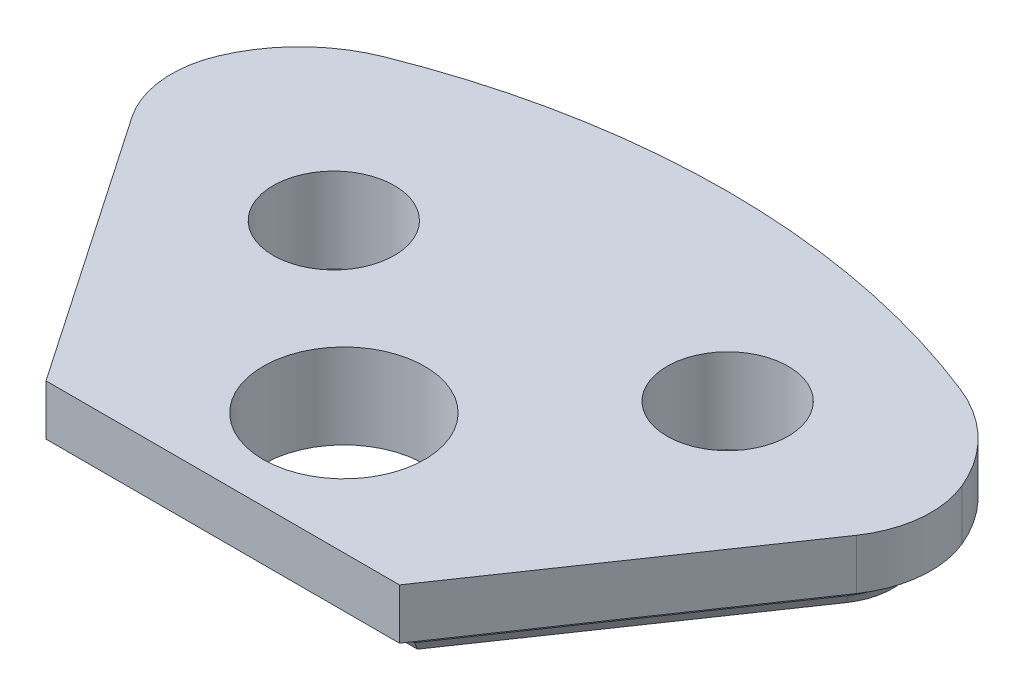
ISO-10303-21;
HEADER;
FILE_DESCRIPTION(('STEP AP214'),'2;1');
FILE_NAME('part.step','',(''),(''),'','','');
FILE_SCHEMA(('AUTOMOTIVE_DESIGN { 1 0 10303 214 1 1 1 1 }'));
ENDSEC;
DATA;
#1=APPLICATION_CONTEXT('core data for automotive mechanical design processes');
#2=APPLICATION_PROTOCOL_DEFINITION('international standard','automotive_design',2000,#1);
#3=PRODUCT_CONTEXT('',#1,'mechanical');
#4=PRODUCT('Part','Part','',(#3));
#5=PRODUCT_RELATED_PRODUCT_CATEGORY('part','',(#4));
#6=PRODUCT_DEFINITION_FORMATION('','',#4);
#7=PRODUCT_DEFINITION_CONTEXT('part definition',#1,'design');
#8=PRODUCT_DEFINITION('design','',#6,#7);
#9=PRODUCT_DEFINITION_SHAPE('','',#8);
#10=(LENGTH_UNIT() NAMED_UNIT(*) SI_UNIT(.MILLI.,.METRE.));
#11=(NAMED_UNIT(*) PLANE_ANGLE_UNIT() SI_UNIT($,.RADIAN.));
#12=(NAMED_UNIT(*) SI_UNIT($,.STERADIAN.) SOLID_ANGLE_UNIT());
#13=UNCERTAINTY_MEASURE_WITH_UNIT(LENGTH_MEASURE(1.E-05),#10,'distance_accuracy_value','');
#14=(GEOMETRIC_REPRESENTATION_CONTEXT(3) GLOBAL_UNCERTAINTY_ASSIGNED_CONTEXT((#13)) GLOBAL_UNIT_ASSIGNED_CONTEXT((#10,
#11,#12)) REPRESENTATION_CONTEXT('',''));
#15=CARTESIAN_POINT('',(0.,0.,0.));
#16=DIRECTION('',(0.,0.,1.));
#17=DIRECTION('',(1.,0.,0.));
#18=AXIS2_PLACEMENT_3D('',#15,#16,#17);
#19=CARTESIAN_POINT('',(0.,0.,27.2));
#20=DIRECTION('',(0.,-1.,0.));
#21=DIRECTION('',(0.,0.,-1.));
#22=AXIS2_PLACEMENT_3D('',#19,#20,#21);
#23=PLANE('',#22);
#24=CARTESIAN_POINT('',(23.,0.,-30.5913488335408));
#25=DIRECTION('',(0.,-1.,0.));
#26=DIRECTION('',(0.,0.,-1.));
#27=AXIS2_PLACEMENT_3D('',#24,#25,#26);
#28=CIRCLE('',#27,15.);
#29=CARTESIAN_POINT('',(28.5466237942122,0.,-44.5281692917902));
#30=VERTEX_POINT('',#29);
#31=CARTESIAN_POINT('',(36.8359769781785,0.,-36.384943663982));
#32=VERTEX_POINT('',#31);
#33=EDGE_CURVE('E232',#30,#32,#28,.T.);
#34=ORIENTED_EDGE('',*,*,#33,.T.);
#35=CARTESIAN_POINT('',(27.6119923260595,0.,-32.5225471103545));
#36=DIRECTION('',(0.,-1.,0.));
#37=DIRECTION('',(0.,0.,-1.));
#38=AXIS2_PLACEMENT_3D('',#35,#36,#37);
#39=CIRCLE('',#38,10.);
#40=CARTESIAN_POINT('',(35.8684387410676,0.,-26.880642060099));
#41=VERTEX_POINT('',#40);
#42=EDGE_CURVE('E245',#32,#41,#39,.T.);
#43=ORIENTED_EDGE('',*,*,#42,.T.);
#44=DIRECTION('',(0.564190505025556,0.,-0.825644641500814));
#45=VECTOR('',#44,1.);
#46=CARTESIAN_POINT('',(17.5,0.,0.));
#47=LINE('',#46,#45);
#48=CARTESIAN_POINT('',(17.5,0.,0.));
#49=VERTEX_POINT('',#48);
#50=EDGE_CURVE('E215',#49,#41,#47,.T.);
#51=ORIENTED_EDGE('',*,*,#50,.F.);
#52=DIRECTION('',(1.,0.,0.));
#53=VECTOR('',#52,1.);
#54=CARTESIAN_POINT('',(17.5,0.,0.));
#55=LINE('',#54,#53);
#56=CARTESIAN_POINT('',(-17.5,0.,0.));
#57=VERTEX_POINT('',#56);
#58=EDGE_CURVE('E192',#57,#49,#55,.T.);
#59=ORIENTED_EDGE('',*,*,#58,.F.);
#60=DIRECTION('',(0.564190505025556,0.,0.825644641500814));
#61=VECTOR('',#60,1.);
#62=CARTESIAN_POINT('',(-38.,0.,-30.));
#63=LINE('',#62,#61);
#64=CARTESIAN_POINT('',(-35.8684387410676,0.,-26.880642060099));
#65=VERTEX_POINT('',#64);
#66=EDGE_CURVE('E189',#65,#57,#63,.T.);
#67=ORIENTED_EDGE('',*,*,#66,.F.);
#68=CARTESIAN_POINT('',(-27.6119923260595,0.,-32.5225471103545));
#69=DIRECTION('',(0.,-1.,0.));
#70=DIRECTION('',(0.,0.,-1.));
#71=AXIS2_PLACEMENT_3D('',#68,#69,#70);
#72=CIRCLE('',#71,10.);
#73=CARTESIAN_POINT('',(-36.8359769781785,0.,-36.384943663982));
#74=VERTEX_POINT('',#73);
#75=EDGE_CURVE('E243',#65,#74,#72,.T.);
#76=ORIENTED_EDGE('',*,*,#75,.T.);
#77=CARTESIAN_POINT('',(-23.,0.,-30.5913488335408));
#78=DIRECTION('',(0.,-1.,0.));
#79=DIRECTION('',(0.,0.,-1.));
#80=AXIS2_PLACEMENT_3D('',#77,#78,#79);
#81=CIRCLE('',#80,15.);
#82=CARTESIAN_POINT('',(-28.5466237942122,0.,-44.5281692917902));
#83=VERTEX_POINT('',#82);
#84=EDGE_CURVE('E230',#74,#83,#81,.T.);
#85=ORIENTED_EDGE('',*,*,#84,.T.);
#86=CARTESIAN_POINT('',(0.,0.,27.2));
#87=DIRECTION('',(0.,1.,0.));
#88=DIRECTION('',(0.,0.,-1.));
#89=AXIS2_PLACEMENT_3D('',#86,#87,#88);
#90=CIRCLE('',#89,77.2);
#91=EDGE_CURVE('E205',#30,#83,#90,.T.);
#92=ORIENTED_EDGE('',*,*,#91,.F.);
#93=EDGE_LOOP('',(#34,#43,#51,#59,#67,#76,#85,#92));
#94=FACE_BOUND('',#93,.T.);
#95=CARTESIAN_POINT('',(23.,0.,-30.5913488335408));
#96=DIRECTION('',(0.,-1.,0.));
#97=DIRECTION('',(0.,0.,-1.));
#98=AXIS2_PLACEMENT_3D('',#95,#96,#97);
#99=CIRCLE('',#98,11.8);
#100=CARTESIAN_POINT('',(27.3633440514469,0.,-41.5549809273637));
#101=VERTEX_POINT('',#100);
#102=CARTESIAN_POINT('',(33.8843018895004,0.,-35.1489767668212));
#103=VERTEX_POINT('',#102);
#104=EDGE_CURVE('E195',#101,#103,#99,.T.);
#105=ORIENTED_EDGE('',*,*,#104,.F.);
#106=CARTESIAN_POINT('',(0.,0.,27.2));
#107=DIRECTION('',(0.,-1.,0.));
#108=DIRECTION('',(0.,0.,-1.));
#109=AXIS2_PLACEMENT_3D('',#106,#107,#108);
#110=CIRCLE('',#109,74.);
#111=CARTESIAN_POINT('',(-27.3633440514469,0.,-41.5549809273637));
#112=VERTEX_POINT('',#111);
#113=EDGE_CURVE('E186',#101,#112,#110,.F.);
#114=ORIENTED_EDGE('',*,*,#113,.T.);
#115=CARTESIAN_POINT('',(-23.,0.,-30.5913488335408));
#116=DIRECTION('',(0.,-1.,0.));
#117=DIRECTION('',(0.,0.,-1.));
#118=AXIS2_PLACEMENT_3D('',#115,#116,#117);
#119=CIRCLE('',#118,11.8);
#120=CARTESIAN_POINT('',(-33.8843018895004,0.,-35.1489767668212));
#121=VERTEX_POINT('',#120);
#122=EDGE_CURVE('E334',#121,#112,#119,.T.);
#123=ORIENTED_EDGE('',*,*,#122,.F.);
#124=CARTESIAN_POINT('',(-27.6119923260595,0.,-32.5225471103545));
#125=DIRECTION('',(0.,-1.,0.));
#126=DIRECTION('',(0.,0.,-1.));
#127=AXIS2_PLACEMENT_3D('',#124,#125,#126);
#128=CIRCLE('',#127,6.8);
#129=CARTESIAN_POINT('',(-33.226375888265,0.,-28.6860516761807));
#130=VERTEX_POINT('',#129);
#131=EDGE_CURVE('E190',#130,#121,#128,.T.);
#132=ORIENTED_EDGE('',*,*,#131,.F.);
#133=DIRECTION('',(0.564190505025556,0.,0.825644641500814));
#134=VECTOR('',#133,1.);
#135=CARTESIAN_POINT('',(3.38283164659165,0.,24.888398374829));
#136=LINE('',#135,#134);
#137=CARTESIAN_POINT('',(-15.8109072428749,0.,-3.19999999999999));
#138=VERTEX_POINT('',#137);
#139=EDGE_CURVE('E201',#130,#138,#136,.T.);
#140=ORIENTED_EDGE('',*,*,#139,.T.);
#141=DIRECTION('',(1.,0.,0.));
#142=VECTOR('',#141,1.);
#143=CARTESIAN_POINT('',(0.,0.,-3.19999999999999));
#144=LINE('',#143,#142);
#145=CARTESIAN_POINT('',(15.8109072428748,0.,-3.19999999999999));
#146=VERTEX_POINT('',#145);
#147=EDGE_CURVE('E185',#138,#146,#144,.T.);
#148=ORIENTED_EDGE('',*,*,#147,.T.);
#149=DIRECTION('',(0.564190505025556,0.,-0.825644641500814));
#150=VECTOR('',#149,1.);
#151=CARTESIAN_POINT('',(-3.38283164659165,0.,24.888398374829));
#152=LINE('',#151,#150);
#153=CARTESIAN_POINT('',(33.226375888265,0.,-28.6860516761808));
#154=VERTEX_POINT('',#153);
#155=EDGE_CURVE('E173',#146,#154,#152,.T.);
#156=ORIENTED_EDGE('',*,*,#155,.T.);
#157=CARTESIAN_POINT('',(27.6119923260595,0.,-32.5225471103545));
#158=DIRECTION('',(0.,-1.,0.));
#159=DIRECTION('',(0.,0.,-1.));
#160=AXIS2_PLACEMENT_3D('',#157,#158,#159);
#161=CIRCLE('',#160,6.8);
#162=EDGE_CURVE('E181',#103,#154,#161,.T.);
#163=ORIENTED_EDGE('',*,*,#162,.F.);
#164=EDGE_LOOP('',(#105,#114,#123,#132,#140,#148,#156,#163));
#165=FACE_BOUND('',#164,.T.);
#166=ADVANCED_FACE('F35',(#94,#165),#23,.T.);
#167=CARTESIAN_POINT('',(-38.,5.,-30.));
#168=DIRECTION('',(0.825644641500814,0.,-0.564190505025556));
#169=DIRECTION('',(-0.564190505025556,0.,-0.825644641500814));
#170=AXIS2_PLACEMENT_3D('',#167,#168,#169);
#171=PLANE('',#170);
#172=DIRECTION('',(0.564190505025556,0.,0.825644641500814));
#173=VECTOR('',#172,1.);
#174=CARTESIAN_POINT('',(-38.,5.,-30.));
#175=LINE('',#174,#173);
#176=CARTESIAN_POINT('',(-35.8684387410676,5.,-26.880642060099));
#177=VERTEX_POINT('',#176);
#178=CARTESIAN_POINT('',(-17.5,5.,0.));
#179=VERTEX_POINT('',#178);
#180=EDGE_CURVE('E202',#177,#179,#175,.T.);
#181=ORIENTED_EDGE('',*,*,#180,.F.);
#182=DIRECTION('',(0.,1.,0.));
#183=VECTOR('',#182,1.);
#184=CARTESIAN_POINT('',(-35.8684387410676,0.,-26.880642060099));
#185=LINE('',#184,#183);
#186=EDGE_CURVE('E253',#177,#65,#185,.F.);
#187=ORIENTED_EDGE('',*,*,#186,.T.);
#188=ORIENTED_EDGE('',*,*,#66,.T.);
#189=DIRECTION('',(0.,-1.,0.));
#190=VECTOR('',#189,1.);
#191=CARTESIAN_POINT('',(-17.5,5.,0.));
#192=LINE('',#191,#190);
#193=EDGE_CURVE('E222',#179,#57,#192,.T.);
#194=ORIENTED_EDGE('',*,*,#193,.F.);
#195=EDGE_LOOP('',(#181,#187,#188,#194));
#196=FACE_BOUND('',#195,.T.);
#197=ADVANCED_FACE('F420',(#196),#171,.F.);
#198=CARTESIAN_POINT('',(17.5,5.,0.));
#199=DIRECTION('',(0.,0.,-1.));
#200=DIRECTION('',(-1.,0.,0.));
#201=AXIS2_PLACEMENT_3D('',#198,#199,#200);
#202=PLANE('',#201);
#203=ORIENTED_EDGE('',*,*,#58,.T.);
#204=DIRECTION('',(0.,-1.,0.));
#205=VECTOR('',#204,1.);
#206=CARTESIAN_POINT('',(17.5,5.,0.));
#207=LINE('',#206,#205);
#208=CARTESIAN_POINT('',(17.5,5.,0.));
#209=VERTEX_POINT('',#208);
#210=EDGE_CURVE('E212',#209,#49,#207,.T.);
#211=ORIENTED_EDGE('',*,*,#210,.F.);
#212=DIRECTION('',(1.,0.,0.));
#213=VECTOR('',#212,1.);
#214=CARTESIAN_POINT('',(17.5,5.,0.));
#215=LINE('',#214,#213);
#216=EDGE_CURVE('E204',#179,#209,#215,.T.);
#217=ORIENTED_EDGE('',*,*,#216,.F.);
#218=ORIENTED_EDGE('',*,*,#193,.T.);
#219=EDGE_LOOP('',(#203,#211,#217,#218));
#220=FACE_BOUND('',#219,.T.);
#221=ADVANCED_FACE('F424',(#220),#202,.F.);
#222=CARTESIAN_POINT('',(17.5,5.,0.));
#223=DIRECTION('',(-0.825644641500814,0.,-0.564190505025556));
#224=DIRECTION('',(-0.564190505025556,0.,0.825644641500814));
#225=AXIS2_PLACEMENT_3D('',#222,#223,#224);
#226=PLANE('',#225);
#227=ORIENTED_EDGE('',*,*,#50,.T.);
#228=DIRECTION('',(0.,1.,0.));
#229=VECTOR('',#228,1.);
#230=CARTESIAN_POINT('',(35.8684387410676,5.,-26.880642060099));
#231=LINE('',#230,#229);
#232=CARTESIAN_POINT('',(35.8684387410676,5.,-26.880642060099));
#233=VERTEX_POINT('',#232);
#234=EDGE_CURVE('E247',#41,#233,#231,.T.);
#235=ORIENTED_EDGE('',*,*,#234,.T.);
#236=DIRECTION('',(0.564190505025556,0.,-0.825644641500814));
#237=VECTOR('',#236,1.);
#238=CARTESIAN_POINT('',(17.5,5.,0.));
#239=LINE('',#238,#237);
#240=EDGE_CURVE('E207',#209,#233,#239,.T.);
#241=ORIENTED_EDGE('',*,*,#240,.F.);
#242=ORIENTED_EDGE('',*,*,#210,.T.);
#243=EDGE_LOOP('',(#227,#235,#241,#242));
#244=FACE_BOUND('',#243,.T.);
#245=ADVANCED_FACE('F425',(#244),#226,.F.);
#246=CARTESIAN_POINT('',(0.,5.,27.2));
#247=DIRECTION('',(0.,-1.,0.));
#248=DIRECTION('',(0.,0.,-1.));
#249=AXIS2_PLACEMENT_3D('',#246,#247,#248);
#250=CYLINDRICAL_SURFACE('',#249,77.2);
#251=CARTESIAN_POINT('',(0.,5.,27.2));
#252=DIRECTION('',(0.,1.,0.));
#253=DIRECTION('',(0.,0.,-1.));
#254=AXIS2_PLACEMENT_3D('',#251,#252,#253);
#255=CIRCLE('',#254,77.2);
#256=CARTESIAN_POINT('',(28.5466237942122,5.,-44.5281692917902));
#257=VERTEX_POINT('',#256);
#258=CARTESIAN_POINT('',(-28.5466237942122,5.,-44.5281692917902));
#259=VERTEX_POINT('',#258);
#260=EDGE_CURVE('E210',#257,#259,#255,.T.);
#261=ORIENTED_EDGE('',*,*,#260,.F.);
#262=DIRECTION('',(0.,-1.,0.));
#263=VECTOR('',#262,1.);
#264=CARTESIAN_POINT('',(28.5466237942122,5.,-44.5281692917902));
#265=LINE('',#264,#263);
#266=EDGE_CURVE('E227',#257,#30,#265,.T.);
#267=ORIENTED_EDGE('',*,*,#266,.T.);
#268=ORIENTED_EDGE('',*,*,#91,.T.);
#269=DIRECTION('',(0.,-1.,0.));
#270=VECTOR('',#269,1.);
#271=CARTESIAN_POINT('',(-28.5466237942122,5.,-44.5281692917902));
#272=LINE('',#271,#270);
#273=EDGE_CURVE('E225',#83,#259,#272,.F.);
#274=ORIENTED_EDGE('',*,*,#273,.T.);
#275=EDGE_LOOP('',(#261,#267,#268,#274));
#276=FACE_BOUND('',#275,.T.);
#277=ADVANCED_FACE('F384',(#276),#250,.T.);
#278=CARTESIAN_POINT('',(0.,5.,27.2));
#279=DIRECTION('',(0.,-1.,0.));
#280=DIRECTION('',(0.,0.,-1.));
#281=AXIS2_PLACEMENT_3D('',#278,#279,#280);
#282=PLANE('',#281);
#283=CARTESIAN_POINT('',(18.,5.,-32.));
#284=DIRECTION('',(0.,1.,0.));
#285=DIRECTION('',(0.,0.,1.));
#286=AXIS2_PLACEMENT_3D('',#283,#284,#285);
#287=CIRCLE('',#286,6.);
#288=CARTESIAN_POINT('',(18.,5.,-26.));
#289=VERTEX_POINT('',#288);
#290=EDGE_CURVE('E364',#289,#289,#287,.T.);
#291=ORIENTED_EDGE('',*,*,#290,.F.);
#292=EDGE_LOOP('',(#291));
#293=FACE_BOUND('',#292,.T.);
#294=CARTESIAN_POINT('',(-17.,5.,-28.));
#295=DIRECTION('',(0.,1.,0.));
#296=DIRECTION('',(0.,0.,1.));
#297=AXIS2_PLACEMENT_3D('',#294,#295,#296);
#298=CIRCLE('',#297,6.);
#299=CARTESIAN_POINT('',(-17.,5.,-22.));
#300=VERTEX_POINT('',#299);
#301=EDGE_CURVE('E358',#300,#300,#298,.T.);
#302=ORIENTED_EDGE('',*,*,#301,.F.);
#303=EDGE_LOOP('',(#302));
#304=FACE_BOUND('',#303,.T.);
#305=CARTESIAN_POINT('',(0.,5.,-12.));
#306=DIRECTION('',(0.,1.,0.));
#307=DIRECTION('',(0.,0.,1.));
#308=AXIS2_PLACEMENT_3D('',#305,#306,#307);
#309=CIRCLE('',#308,8.);
#310=CARTESIAN_POINT('',(0.,5.,-3.99999999999999));
#311=VERTEX_POINT('',#310);
#312=EDGE_CURVE('E352',#311,#311,#309,.T.);
#313=ORIENTED_EDGE('',*,*,#312,.F.);
#314=EDGE_LOOP('',(#313));
#315=FACE_BOUND('',#314,.T.);
#316=ORIENTED_EDGE('',*,*,#240,.T.);
#317=CARTESIAN_POINT('',(27.6119923260595,5.,-32.5225471103545));
#318=DIRECTION('',(0.,-1.,0.));
#319=DIRECTION('',(0.,0.,-1.));
#320=AXIS2_PLACEMENT_3D('',#317,#318,#319);
#321=CIRCLE('',#320,10.);
#322=CARTESIAN_POINT('',(36.8359769781785,5.,-36.384943663982));
#323=VERTEX_POINT('',#322);
#324=EDGE_CURVE('E251',#233,#323,#321,.F.);
#325=ORIENTED_EDGE('',*,*,#324,.T.);
#326=CARTESIAN_POINT('',(23.,5.,-30.5913488335408));
#327=DIRECTION('',(0.,-1.,0.));
#328=DIRECTION('',(0.,0.,-1.));
#329=AXIS2_PLACEMENT_3D('',#326,#327,#328);
#330=CIRCLE('',#329,15.);
#331=EDGE_CURVE('E238',#323,#257,#330,.F.);
#332=ORIENTED_EDGE('',*,*,#331,.T.);
#333=ORIENTED_EDGE('',*,*,#260,.T.);
#334=CARTESIAN_POINT('',(-23.,5.,-30.5913488335408));
#335=DIRECTION('',(0.,-1.,0.));
#336=DIRECTION('',(0.,0.,-1.));
#337=AXIS2_PLACEMENT_3D('',#334,#335,#336);
#338=CIRCLE('',#337,15.);
#339=CARTESIAN_POINT('',(-36.8359769781785,5.,-36.384943663982));
#340=VERTEX_POINT('',#339);
#341=EDGE_CURVE('E235',#259,#340,#338,.F.);
#342=ORIENTED_EDGE('',*,*,#341,.T.);
#343=CARTESIAN_POINT('',(-27.6119923260595,5.,-32.5225471103545));
#344=DIRECTION('',(0.,-1.,0.));
#345=DIRECTION('',(0.,0.,-1.));
#346=AXIS2_PLACEMENT_3D('',#343,#344,#345);
#347=CIRCLE('',#346,10.);
#348=EDGE_CURVE('E249',#340,#177,#347,.F.);
#349=ORIENTED_EDGE('',*,*,#348,.T.);
#350=ORIENTED_EDGE('',*,*,#180,.T.);
#351=ORIENTED_EDGE('',*,*,#216,.T.);
#352=EDGE_LOOP('',(#316,#325,#332,#333,#342,#349,#350,#351));
#353=FACE_BOUND('',#352,.T.);
#354=ADVANCED_FACE('F380',(#293,#304,#315,#353),#282,.F.);
#355=CARTESIAN_POINT('',(23.,5.,-30.5913488335408));
#356=DIRECTION('',(0.,-1.,0.));
#357=DIRECTION('',(0.,0.,-1.));
#358=AXIS2_PLACEMENT_3D('',#355,#356,#357);
#359=CYLINDRICAL_SURFACE('',#358,15.);
#360=ORIENTED_EDGE('',*,*,#331,.F.);
#361=DIRECTION('',(0.,-1.,0.));
#362=VECTOR('',#361,1.);
#363=CARTESIAN_POINT('',(36.8359769781785,5.,-36.384943663982));
#364=LINE('',#363,#362);
#365=EDGE_CURVE('E240',#323,#32,#364,.T.);
#366=ORIENTED_EDGE('',*,*,#365,.T.);
#367=ORIENTED_EDGE('',*,*,#33,.F.);
#368=ORIENTED_EDGE('',*,*,#266,.F.);
#369=EDGE_LOOP('',(#360,#366,#367,#368));
#370=FACE_BOUND('',#369,.T.);
#371=ADVANCED_FACE('F383',(#370),#359,.T.);
#372=CARTESIAN_POINT('',(-23.,5.,-30.5913488335408));
#373=DIRECTION('',(0.,-1.,0.));
#374=DIRECTION('',(0.,0.,-1.));
#375=AXIS2_PLACEMENT_3D('',#372,#373,#374);
#376=CYLINDRICAL_SURFACE('',#375,15.);
#377=ORIENTED_EDGE('',*,*,#84,.F.);
#378=DIRECTION('',(0.,-1.,0.));
#379=VECTOR('',#378,1.);
#380=CARTESIAN_POINT('',(-36.8359769781785,5.,-36.384943663982));
#381=LINE('',#380,#379);
#382=EDGE_CURVE('E256',#74,#340,#381,.F.);
#383=ORIENTED_EDGE('',*,*,#382,.T.);
#384=ORIENTED_EDGE('',*,*,#341,.F.);
#385=ORIENTED_EDGE('',*,*,#273,.F.);
#386=EDGE_LOOP('',(#377,#383,#384,#385));
#387=FACE_BOUND('',#386,.T.);
#388=ADVANCED_FACE('F411',(#387),#376,.T.);
#389=CARTESIAN_POINT('',(27.6119923260595,5.,-32.5225471103545));
#390=DIRECTION('',(0.,-1.,0.));
#391=DIRECTION('',(0.,0.,-1.));
#392=AXIS2_PLACEMENT_3D('',#389,#390,#391);
#393=CYLINDRICAL_SURFACE('',#392,10.);
#394=ORIENTED_EDGE('',*,*,#324,.F.);
#395=ORIENTED_EDGE('',*,*,#234,.F.);
#396=ORIENTED_EDGE('',*,*,#42,.F.);
#397=ORIENTED_EDGE('',*,*,#365,.F.);
#398=EDGE_LOOP('',(#394,#395,#396,#397));
#399=FACE_BOUND('',#398,.T.);
#400=ADVANCED_FACE('F399',(#399),#393,.T.);
#401=CARTESIAN_POINT('',(-27.6119923260595,5.,-32.5225471103545));
#402=DIRECTION('',(0.,-1.,0.));
#403=DIRECTION('',(0.,0.,-1.));
#404=AXIS2_PLACEMENT_3D('',#401,#402,#403);
#405=CYLINDRICAL_SURFACE('',#404,10.);
#406=ORIENTED_EDGE('',*,*,#348,.F.);
#407=ORIENTED_EDGE('',*,*,#382,.F.);
#408=ORIENTED_EDGE('',*,*,#75,.F.);
#409=ORIENTED_EDGE('',*,*,#186,.F.);
#410=EDGE_LOOP('',(#406,#407,#408,#409));
#411=FACE_BOUND('',#410,.T.);
#412=ADVANCED_FACE('F417',(#411),#405,.T.);
#413=CARTESIAN_POINT('',(15.8109072428748,-3.4,-3.19999999999999));
#414=DIRECTION('',(-0.825644641500814,0.,-0.564190505025556));
#415=DIRECTION('',(-0.564190505025556,0.,0.825644641500814));
#416=AXIS2_PLACEMENT_3D('',#413,#414,#415);
#417=PLANE('',#416);
#418=DIRECTION('',(0.,1.,0.));
#419=VECTOR('',#418,1.);
#420=CARTESIAN_POINT('',(15.8109072428748,-3.4,-3.19999999999999));
#421=LINE('',#420,#419);
#422=CARTESIAN_POINT('',(15.8109072428748,-2.39999999999999,-3.19999999999999));
#423=VERTEX_POINT('',#422);
#424=EDGE_CURVE('E345',#423,#146,#421,.T.);
#425=ORIENTED_EDGE('',*,*,#424,.F.);
#426=DIRECTION('',(0.564190505025556,0.,-0.825644641500814));
#427=VECTOR('',#426,1.);
#428=CARTESIAN_POINT('',(15.8109072428748,-2.39999999999999,-3.19999999999999));
#429=LINE('',#428,#427);
#430=CARTESIAN_POINT('',(33.226375888265,-2.39999999999999,-28.6860516761808));
#431=VERTEX_POINT('',#430);
#432=EDGE_CURVE('E11',#423,#431,#429,.T.);
#433=ORIENTED_EDGE('',*,*,#432,.T.);
#434=DIRECTION('',(0.,1.,0.));
#435=VECTOR('',#434,1.);
#436=CARTESIAN_POINT('',(33.226375888265,-3.4,-28.6860516761808));
#437=LINE('',#436,#435);
#438=EDGE_CURVE('E170',#431,#154,#437,.T.);
#439=ORIENTED_EDGE('',*,*,#438,.T.);
#440=ORIENTED_EDGE('',*,*,#155,.F.);
#441=EDGE_LOOP('',(#425,#433,#439,#440));
#442=FACE_BOUND('',#441,.T.);
#443=ADVANCED_FACE('F172',(#442),#417,.F.);
#444=CARTESIAN_POINT('',(15.8109072428748,-3.4,-3.19999999999999));
#445=DIRECTION('',(0.,0.,-1.));
#446=DIRECTION('',(-1.,0.,0.));
#447=AXIS2_PLACEMENT_3D('',#444,#445,#446);
#448=PLANE('',#447);
#449=DIRECTION('',(0.,1.,0.));
#450=VECTOR('',#449,1.);
#451=CARTESIAN_POINT('',(-15.8109072428749,-3.4,-3.19999999999999));
#452=LINE('',#451,#450);
#453=CARTESIAN_POINT('',(-15.8109072428749,-2.39999999999999,-3.19999999999999));
#454=VERTEX_POINT('',#453);
#455=EDGE_CURVE('E343',#454,#138,#452,.T.);
#456=ORIENTED_EDGE('',*,*,#455,.F.);
#457=DIRECTION('',(1.,0.,0.));
#458=VECTOR('',#457,1.);
#459=CARTESIAN_POINT('',(15.8109072428748,-2.39999999999999,-3.19999999999999));
#460=LINE('',#459,#458);
#461=EDGE_CURVE('E275',#454,#423,#460,.T.);
#462=ORIENTED_EDGE('',*,*,#461,.T.);
#463=ORIENTED_EDGE('',*,*,#424,.T.);
#464=ORIENTED_EDGE('',*,*,#147,.F.);
#465=EDGE_LOOP('',(#456,#462,#463,#464));
#466=FACE_BOUND('',#465,.T.);
#467=ADVANCED_FACE('F443',(#466),#448,.F.);
#468=CARTESIAN_POINT('',(-15.8109072428749,-3.4,-3.19999999999999));
#469=DIRECTION('',(0.825644641500814,0.,-0.564190505025556));
#470=DIRECTION('',(-0.564190505025556,0.,-0.825644641500814));
#471=AXIS2_PLACEMENT_3D('',#468,#469,#470);
#472=PLANE('',#471);
#473=DIRECTION('',(0.,1.,0.));
#474=VECTOR('',#473,1.);
#475=CARTESIAN_POINT('',(-33.226375888265,-3.4,-28.6860516761807));
#476=LINE('',#475,#474);
#477=CARTESIAN_POINT('',(-33.226375888265,-2.39999999999999,-28.6860516761807));
#478=VERTEX_POINT('',#477);
#479=EDGE_CURVE('E337',#478,#130,#476,.T.);
#480=ORIENTED_EDGE('',*,*,#479,.F.);
#481=DIRECTION('',(0.564190505025556,0.,0.825644641500814));
#482=VECTOR('',#481,1.);
#483=CARTESIAN_POINT('',(-15.8109072428749,-2.39999999999999,-3.19999999999999));
#484=LINE('',#483,#482);
#485=EDGE_CURVE('E278',#478,#454,#484,.T.);
#486=ORIENTED_EDGE('',*,*,#485,.T.);
#487=ORIENTED_EDGE('',*,*,#455,.T.);
#488=ORIENTED_EDGE('',*,*,#139,.F.);
#489=EDGE_LOOP('',(#480,#486,#487,#488));
#490=FACE_BOUND('',#489,.T.);
#491=ADVANCED_FACE('F446',(#490),#472,.F.);
#492=CARTESIAN_POINT('',(-27.6119923260595,-3.4,-32.5225471103545));
#493=DIRECTION('',(0.,1.,0.));
#494=DIRECTION('',(0.,0.,1.));
#495=AXIS2_PLACEMENT_3D('',#492,#493,#494);
#496=CYLINDRICAL_SURFACE('',#495,6.80000000000002);
#497=DIRECTION('',(0.,1.,0.));
#498=VECTOR('',#497,1.);
#499=CARTESIAN_POINT('',(-33.8843018895004,-3.4,-35.1489767668212));
#500=LINE('',#499,#498);
#501=CARTESIAN_POINT('',(-33.8843018895004,-2.39999999999999,-35.1489767668212));
#502=VERTEX_POINT('',#501);
#503=EDGE_CURVE('E335',#502,#121,#500,.T.);
#504=ORIENTED_EDGE('',*,*,#503,.F.);
#505=CARTESIAN_POINT('',(-27.6119923260595,-2.39999999999999,-32.5225471103545));
#506=DIRECTION('',(0.,1.,0.));
#507=DIRECTION('',(0.,0.,1.));
#508=AXIS2_PLACEMENT_3D('',#505,#506,#507);
#509=CIRCLE('',#508,6.80000000000002);
#510=EDGE_CURVE('E280',#502,#478,#509,.T.);
#511=ORIENTED_EDGE('',*,*,#510,.T.);
#512=ORIENTED_EDGE('',*,*,#479,.T.);
#513=ORIENTED_EDGE('',*,*,#131,.T.);
#514=EDGE_LOOP('',(#504,#511,#512,#513));
#515=FACE_BOUND('',#514,.T.);
#516=ADVANCED_FACE('F450',(#515),#496,.T.);
#517=CARTESIAN_POINT('',(-23.,-3.4,-30.5913488335408));
#518=DIRECTION('',(0.,1.,0.));
#519=DIRECTION('',(0.,0.,1.));
#520=AXIS2_PLACEMENT_3D('',#517,#518,#519);
#521=CYLINDRICAL_SURFACE('',#520,11.8);
#522=DIRECTION('',(0.,1.,0.));
#523=VECTOR('',#522,1.);
#524=CARTESIAN_POINT('',(-27.3633440514469,-3.4,-41.5549809273637));
#525=LINE('',#524,#523);
#526=CARTESIAN_POINT('',(-27.3633440514469,-2.39999999999999,-41.5549809273637));
#527=VERTEX_POINT('',#526);
#528=EDGE_CURVE('E326',#527,#112,#525,.T.);
#529=ORIENTED_EDGE('',*,*,#528,.F.);
#530=CARTESIAN_POINT('',(-23.,-2.39999999999999,-30.5913488335408));
#531=DIRECTION('',(0.,1.,0.));
#532=DIRECTION('',(0.,0.,1.));
#533=AXIS2_PLACEMENT_3D('',#530,#531,#532);
#534=CIRCLE('',#533,11.8);
#535=EDGE_CURVE('E282',#527,#502,#534,.T.);
#536=ORIENTED_EDGE('',*,*,#535,.T.);
#537=ORIENTED_EDGE('',*,*,#503,.T.);
#538=ORIENTED_EDGE('',*,*,#122,.T.);
#539=EDGE_LOOP('',(#529,#536,#537,#538));
#540=FACE_BOUND('',#539,.T.);
#541=ADVANCED_FACE('F331',(#540),#521,.T.);
#542=CARTESIAN_POINT('',(0.,-3.4,27.1999999999984));
#543=DIRECTION('',(0.,1.,0.));
#544=DIRECTION('',(0.,0.,1.));
#545=AXIS2_PLACEMENT_3D('',#542,#543,#544);
#546=CYLINDRICAL_SURFACE('',#545,73.9999999999986);
#547=DIRECTION('',(0.,1.,0.));
#548=VECTOR('',#547,1.);
#549=CARTESIAN_POINT('',(27.363344051447,-3.4,-41.5549809273637));
#550=LINE('',#549,#548);
#551=CARTESIAN_POINT('',(27.363344051447,-2.39999999999999,-41.5549809273637));
#552=VERTEX_POINT('',#551);
#553=EDGE_CURVE('E328',#552,#101,#550,.T.);
#554=ORIENTED_EDGE('',*,*,#553,.F.);
#555=CARTESIAN_POINT('',(0.,-2.39999999999999,27.1999999999984));
#556=DIRECTION('',(0.,1.,0.));
#557=DIRECTION('',(0.,0.,1.));
#558=AXIS2_PLACEMENT_3D('',#555,#556,#557);
#559=CIRCLE('',#558,73.9999999999986);
#560=EDGE_CURVE('E284',#552,#527,#559,.T.);
#561=ORIENTED_EDGE('',*,*,#560,.T.);
#562=ORIENTED_EDGE('',*,*,#528,.T.);
#563=ORIENTED_EDGE('',*,*,#113,.F.);
#564=EDGE_LOOP('',(#554,#561,#562,#563));
#565=FACE_BOUND('',#564,.T.);
#566=ADVANCED_FACE('F324',(#565),#546,.T.);
#567=CARTESIAN_POINT('',(22.9999999999996,-3.4,-30.5913488335404));
#568=DIRECTION('',(0.,1.,0.));
#569=DIRECTION('',(0.,0.,1.));
#570=AXIS2_PLACEMENT_3D('',#567,#568,#569);
#571=CYLINDRICAL_SURFACE('',#570,11.8000000000006);
#572=DIRECTION('',(0.,1.,0.));
#573=VECTOR('',#572,1.);
#574=CARTESIAN_POINT('',(33.8843018895004,-3.4,-35.1489767668212));
#575=LINE('',#574,#573);
#576=CARTESIAN_POINT('',(33.8843018895004,-2.39999999999999,-35.1489767668212));
#577=VERTEX_POINT('',#576);
#578=EDGE_CURVE('E175',#577,#103,#575,.T.);
#579=ORIENTED_EDGE('',*,*,#578,.F.);
#580=CARTESIAN_POINT('',(22.9999999999996,-2.39999999999999,-30.5913488335404));
#581=DIRECTION('',(0.,1.,0.));
#582=DIRECTION('',(0.,0.,1.));
#583=AXIS2_PLACEMENT_3D('',#580,#581,#582);
#584=CIRCLE('',#583,11.8000000000006);
#585=EDGE_CURVE('E286',#577,#552,#584,.T.);
#586=ORIENTED_EDGE('',*,*,#585,.T.);
#587=ORIENTED_EDGE('',*,*,#553,.T.);
#588=ORIENTED_EDGE('',*,*,#104,.T.);
#589=EDGE_LOOP('',(#579,#586,#587,#588));
#590=FACE_BOUND('',#589,.T.);
#591=ADVANCED_FACE('F350',(#590),#571,.T.);
#592=CARTESIAN_POINT('',(27.6119923260595,-3.4,-32.5225471103545));
#593=DIRECTION('',(0.,1.,0.));
#594=DIRECTION('',(0.,0.,1.));
#595=AXIS2_PLACEMENT_3D('',#592,#593,#594);
#596=CYLINDRICAL_SURFACE('',#595,6.8);
#597=ORIENTED_EDGE('',*,*,#438,.F.);
#598=CARTESIAN_POINT('',(27.6119923260595,-2.39999999999999,-32.5225471103545));
#599=DIRECTION('',(0.,1.,0.));
#600=DIRECTION('',(0.,0.,1.));
#601=AXIS2_PLACEMENT_3D('',#598,#599,#600);
#602=CIRCLE('',#601,6.8);
#603=EDGE_CURVE('E44',#431,#577,#602,.T.);
#604=ORIENTED_EDGE('',*,*,#603,.T.);
#605=ORIENTED_EDGE('',*,*,#578,.T.);
#606=ORIENTED_EDGE('',*,*,#162,.T.);
#607=EDGE_LOOP('',(#597,#604,#605,#606));
#608=FACE_BOUND('',#607,.T.);
#609=ADVANCED_FACE('F188',(#608),#596,.T.);
#610=CARTESIAN_POINT('',(27.6119923260595,-3.4,-32.5225471103545));
#611=DIRECTION('',(0.,1.,0.));
#612=DIRECTION('',(0.,0.,1.));
#613=AXIS2_PLACEMENT_3D('',#610,#611,#612);
#614=PLANE('',#613);
#615=CARTESIAN_POINT('',(18.,-3.4,-32.));
#616=DIRECTION('',(0.,1.,0.));
#617=DIRECTION('',(0.,0.,1.));
#618=AXIS2_PLACEMENT_3D('',#615,#616,#617);
#619=CIRCLE('',#618,6.);
#620=CARTESIAN_POINT('',(18.,-3.4,-26.));
#621=VERTEX_POINT('',#620);
#622=EDGE_CURVE('E361',#621,#621,#619,.T.);
#623=ORIENTED_EDGE('',*,*,#622,.T.);
#624=EDGE_LOOP('',(#623));
#625=FACE_BOUND('',#624,.T.);
#626=CARTESIAN_POINT('',(-17.,-3.4,-28.));
#627=DIRECTION('',(0.,1.,0.));
#628=DIRECTION('',(0.,0.,1.));
#629=AXIS2_PLACEMENT_3D('',#626,#627,#628);
#630=CIRCLE('',#629,6.);
#631=CARTESIAN_POINT('',(-17.,-3.4,-22.));
#632=VERTEX_POINT('',#631);
#633=EDGE_CURVE('E355',#632,#632,#630,.T.);
#634=ORIENTED_EDGE('',*,*,#633,.T.);
#635=EDGE_LOOP('',(#634));
#636=FACE_BOUND('',#635,.T.);
#637=CARTESIAN_POINT('',(0.,-3.4,-12.));
#638=DIRECTION('',(0.,1.,0.));
#639=DIRECTION('',(0.,0.,1.));
#640=AXIS2_PLACEMENT_3D('',#637,#638,#639);
#641=CIRCLE('',#640,8.);
#642=CARTESIAN_POINT('',(0.,-3.4,-3.99999999999999));
#643=VERTEX_POINT('',#642);
#644=EDGE_CURVE('E292',#643,#643,#641,.T.);
#645=ORIENTED_EDGE('',*,*,#644,.T.);
#646=EDGE_LOOP('',(#645));
#647=FACE_BOUND('',#646,.T.);
#648=DIRECTION('',(-0.564190505025556,0.,0.825644641500814));
#649=VECTOR('',#648,1.);
#650=CARTESIAN_POINT('',(32.7496897322396,-3.4,-29.0117872161315));
#651=LINE('',#650,#649);
#652=CARTESIAN_POINT('',(32.7496897322396,-3.4,-29.0117872161315));
#653=VERTEX_POINT('',#652);
#654=CARTESIAN_POINT('',(15.506157818496,-3.4,-3.77735026918963));
#655=VERTEX_POINT('',#654);
#656=EDGE_CURVE('E258',#653,#655,#651,.T.);
#657=ORIENTED_EDGE('',*,*,#656,.T.);
#658=DIRECTION('',(-1.,0.,0.));
#659=VECTOR('',#658,1.);
#660=CARTESIAN_POINT('',(27.6119923260595,-3.4,-3.77735026918963));
#661=LINE('',#660,#659);
#662=CARTESIAN_POINT('',(-15.506157818496,-3.4,-3.77735026918963));
#663=VERTEX_POINT('',#662);
#664=EDGE_CURVE('E272',#655,#663,#661,.T.);
#665=ORIENTED_EDGE('',*,*,#664,.T.);
#666=DIRECTION('',(-0.564190505025556,0.,-0.825644641500814));
#667=VECTOR('',#666,1.);
#668=CARTESIAN_POINT('',(-15.1712920423679,-3.4,-3.28730279192912));
#669=LINE('',#668,#667);
#670=CARTESIAN_POINT('',(-32.7496897322396,-3.4,-29.0117872161315));
#671=VERTEX_POINT('',#670);
#672=EDGE_CURVE('E270',#663,#671,#669,.T.);
#673=ORIENTED_EDGE('',*,*,#672,.T.);
#674=CARTESIAN_POINT('',(-27.6119923260595,-3.4,-32.5225471103545));
#675=DIRECTION('',(0.,1.,0.));
#676=DIRECTION('',(0.,0.,1.));
#677=AXIS2_PLACEMENT_3D('',#674,#675,#676);
#678=CIRCLE('',#677,6.22264973081038);
#679=CARTESIAN_POINT('',(-33.3517548873102,-3.4,-34.9259811978258));
#680=VERTEX_POINT('',#679);
#681=EDGE_CURVE('E268',#671,#680,#678,.F.);
#682=ORIENTED_EDGE('',*,*,#681,.T.);
#683=CARTESIAN_POINT('',(-23.,-3.4,-30.5913488335408));
#684=DIRECTION('',(0.,1.,0.));
#685=DIRECTION('',(0.,0.,1.));
#686=AXIS2_PLACEMENT_3D('',#683,#684,#685);
#687=CIRCLE('',#686,11.2226497308104);
#688=CARTESIAN_POINT('',(-27.1498544020681,-3.4,-41.0185524578158));
#689=VERTEX_POINT('',#688);
#690=EDGE_CURVE('E266',#680,#689,#687,.F.);
#691=ORIENTED_EDGE('',*,*,#690,.T.);
#692=CARTESIAN_POINT('',(0.,-3.4,27.1999999999984));
#693=DIRECTION('',(0.,1.,0.));
#694=DIRECTION('',(0.,0.,1.));
#695=AXIS2_PLACEMENT_3D('',#692,#693,#694);
#696=CIRCLE('',#695,73.4226497308089);
#697=CARTESIAN_POINT('',(27.1498544020681,-3.4,-41.0185524578158));
#698=VERTEX_POINT('',#697);
#699=EDGE_CURVE('E264',#689,#698,#696,.F.);
#700=ORIENTED_EDGE('',*,*,#699,.T.);
#701=CARTESIAN_POINT('',(22.9999999999996,-3.4,-30.5913488335404));
#702=DIRECTION('',(0.,1.,0.));
#703=DIRECTION('',(0.,0.,1.));
#704=AXIS2_PLACEMENT_3D('',#701,#702,#703);
#705=CIRCLE('',#704,11.2226497308109);
#706=CARTESIAN_POINT('',(33.3517548873102,-3.4,-34.9259811978258));
#707=VERTEX_POINT('',#706);
#708=EDGE_CURVE('E262',#698,#707,#705,.F.);
#709=ORIENTED_EDGE('',*,*,#708,.T.);
#710=CARTESIAN_POINT('',(27.6119923260595,-3.4,-32.5225471103545));
#711=DIRECTION('',(0.,1.,0.));
#712=DIRECTION('',(0.,0.,1.));
#713=AXIS2_PLACEMENT_3D('',#710,#711,#712);
#714=CIRCLE('',#713,6.22264973081037);
#715=EDGE_CURVE('E260',#707,#653,#714,.F.);
#716=ORIENTED_EDGE('',*,*,#715,.T.);
#717=EDGE_LOOP('',(#657,#665,#673,#682,#691,#700,#709,#716));
#718=FACE_BOUND('',#717,.T.);
#719=ADVANCED_FACE('F370',(#625,#636,#647,#718),#614,.F.);
#720=CARTESIAN_POINT('',(0.,-3.4,27.1999999999984));
#721=DIRECTION('',(0.,1.,0.));
#722=DIRECTION('',(0.,0.,1.));
#723=AXIS2_PLACEMENT_3D('',#720,#721,#722);
#724=CONICAL_SURFACE('',#723,73.4226497308089,0.523598775598308);
#725=DIRECTION('',(0.184887459807075,-0.866025403784439,0.464560681941645));
#726=VECTOR('',#725,1.);
#727=CARTESIAN_POINT('',(-27.3633440514469,-2.39999999999999,-41.5549809273637));
#728=LINE('',#727,#726);
#729=EDGE_CURVE('E305',#527,#689,#728,.T.);
#730=ORIENTED_EDGE('',*,*,#729,.F.);
#731=ORIENTED_EDGE('',*,*,#560,.F.);
#732=DIRECTION('',(0.184887459807078,0.866025403784438,-0.464560681941645));
#733=VECTOR('',#732,1.);
#734=CARTESIAN_POINT('',(27.1498544020682,-3.4,-41.0185524578158));
#735=LINE('',#734,#733);
#736=EDGE_CURVE('E39',#698,#552,#735,.T.);
#737=ORIENTED_EDGE('',*,*,#736,.F.);
#738=ORIENTED_EDGE('',*,*,#699,.F.);
#739=EDGE_LOOP('',(#730,#731,#737,#738));
#740=FACE_BOUND('',#739,.T.);
#741=ADVANCED_FACE('F37',(#740),#724,.T.);
#742=CARTESIAN_POINT('',(22.9999999999996,-3.4,-30.5913488335404));
#743=DIRECTION('',(0.,1.,0.));
#744=DIRECTION('',(0.,0.,1.));
#745=AXIS2_PLACEMENT_3D('',#742,#743,#744);
#746=CONICAL_SURFACE('',#745,11.2226497308109,0.523598775598298);
#747=ORIENTED_EDGE('',*,*,#736,.T.);
#748=ORIENTED_EDGE('',*,*,#585,.F.);
#749=DIRECTION('',(0.461199232605948,0.866025403784438,-0.193119827681382));
#750=VECTOR('',#749,1.);
#751=CARTESIAN_POINT('',(33.3517548873102,-3.4,-34.9259811978258));
#752=LINE('',#751,#750);
#753=EDGE_CURVE('E303',#707,#577,#752,.T.);
#754=ORIENTED_EDGE('',*,*,#753,.F.);
#755=ORIENTED_EDGE('',*,*,#708,.F.);
#756=EDGE_LOOP('',(#747,#748,#754,#755));
#757=FACE_BOUND('',#756,.T.);
#758=ADVANCED_FACE('F316',(#757),#746,.T.);
#759=CARTESIAN_POINT('',(-23.,-3.4,-30.5913488335408));
#760=DIRECTION('',(0.,1.,0.));
#761=DIRECTION('',(0.,0.,1.));
#762=AXIS2_PLACEMENT_3D('',#759,#760,#761);
#763=CONICAL_SURFACE('',#762,11.2226497308104,0.523598775598299);
#764=ORIENTED_EDGE('',*,*,#729,.T.);
#765=ORIENTED_EDGE('',*,*,#690,.F.);
#766=DIRECTION('',(0.461199232605953,-0.866025403784437,0.193119827681369));
#767=VECTOR('',#766,1.);
#768=CARTESIAN_POINT('',(-33.8843018895004,-2.39999999999999,-35.1489767668212));
#769=LINE('',#768,#767);
#770=EDGE_CURVE('E300',#502,#680,#769,.T.);
#771=ORIENTED_EDGE('',*,*,#770,.F.);
#772=ORIENTED_EDGE('',*,*,#535,.F.);
#773=EDGE_LOOP('',(#764,#765,#771,#772));
#774=FACE_BOUND('',#773,.T.);
#775=ADVANCED_FACE('F499',(#774),#763,.T.);
#776=CARTESIAN_POINT('',(27.6119923260595,-3.4,-32.5225471103545));
#777=DIRECTION('',(0.,1.,0.));
#778=DIRECTION('',(0.,0.,1.));
#779=AXIS2_PLACEMENT_3D('',#776,#777,#778);
#780=CONICAL_SURFACE('',#779,6.22264973081037,0.523598775598297);
#781=ORIENTED_EDGE('',*,*,#753,.T.);
#782=ORIENTED_EDGE('',*,*,#603,.F.);
#783=DIRECTION('',(0.412822320750402,0.866025403784441,0.282095252512776));
#784=VECTOR('',#783,1.);
#785=CARTESIAN_POINT('',(32.7496897322396,-3.4,-29.0117872161315));
#786=LINE('',#785,#784);
#787=EDGE_CURVE('E297',#653,#431,#786,.T.);
#788=ORIENTED_EDGE('',*,*,#787,.F.);
#789=ORIENTED_EDGE('',*,*,#715,.F.);
#790=EDGE_LOOP('',(#781,#782,#788,#789));
#791=FACE_BOUND('',#790,.T.);
#792=ADVANCED_FACE('F501',(#791),#780,.T.);
#793=CARTESIAN_POINT('',(-27.6119923260595,-3.4,-32.5225471103545));
#794=DIRECTION('',(0.,1.,0.));
#795=DIRECTION('',(0.,0.,1.));
#796=AXIS2_PLACEMENT_3D('',#793,#794,#795);
#797=CONICAL_SURFACE('',#796,6.22264973081038,0.523598775598298);
#798=ORIENTED_EDGE('',*,*,#770,.T.);
#799=ORIENTED_EDGE('',*,*,#681,.F.);
#800=DIRECTION('',(0.412822320750407,-0.866025403784438,-0.282095252512778));
#801=VECTOR('',#800,1.);
#802=CARTESIAN_POINT('',(-33.226375888265,-2.39999999999999,-28.6860516761807));
#803=LINE('',#802,#801);
#804=EDGE_CURVE('E294',#478,#671,#803,.T.);
#805=ORIENTED_EDGE('',*,*,#804,.F.);
#806=ORIENTED_EDGE('',*,*,#510,.F.);
#807=EDGE_LOOP('',(#798,#799,#805,#806));
#808=FACE_BOUND('',#807,.T.);
#809=ADVANCED_FACE('F496',(#808),#797,.T.);
#810=CARTESIAN_POINT('',(32.7496897322396,-3.4,-29.0117872161315));
#811=DIRECTION('',(-0.7150292340382,0.5,-0.488603309926104));
#812=DIRECTION('',(-0.564190505025556,0.,0.825644641500814));
#813=AXIS2_PLACEMENT_3D('',#810,#811,#812);
#814=PLANE('',#813);
#815=ORIENTED_EDGE('',*,*,#787,.T.);
#816=ORIENTED_EDGE('',*,*,#432,.F.);
#817=DIRECTION('',(-0.255183055737247,-0.83735369232389,-0.483446379670124));
#818=VECTOR('',#817,1.);
#819=CARTESIAN_POINT('',(13.5159239178761,-9.93072242769983,-7.54786462082484));
#820=LINE('',#819,#818);
#821=EDGE_CURVE('E291',#655,#423,#820,.F.);
#822=ORIENTED_EDGE('',*,*,#821,.F.);
#823=ORIENTED_EDGE('',*,*,#656,.F.);
#824=EDGE_LOOP('',(#815,#816,#822,#823));
#825=FACE_BOUND('',#824,.T.);
#826=ADVANCED_FACE('F485',(#825),#814,.F.);
#827=CARTESIAN_POINT('',(-15.1712920423679,-3.4,-3.28730279192912));
#828=DIRECTION('',(0.715029234038201,0.499999999999999,-0.488603309926104));
#829=DIRECTION('',(-0.564190505025556,0.,-0.825644641500814));
#830=AXIS2_PLACEMENT_3D('',#827,#828,#829);
#831=PLANE('',#830);
#832=ORIENTED_EDGE('',*,*,#804,.T.);
#833=ORIENTED_EDGE('',*,*,#672,.F.);
#834=DIRECTION('',(-0.255183055737245,0.83735369232389,0.483446379670124));
#835=VECTOR('',#834,1.);
#836=CARTESIAN_POINT('',(-15.5448077437631,-3.27317473906344,-3.70412767064786));
#837=LINE('',#836,#835);
#838=EDGE_CURVE('E289',#454,#663,#837,.F.);
#839=ORIENTED_EDGE('',*,*,#838,.F.);
#840=ORIENTED_EDGE('',*,*,#485,.F.);
#841=EDGE_LOOP('',(#832,#833,#839,#840));
#842=FACE_BOUND('',#841,.T.);
#843=ADVANCED_FACE('F492',(#842),#831,.F.);
#844=CARTESIAN_POINT('',(27.6119923260595,-3.4,-3.77735026918963));
#845=DIRECTION('',(0.,0.499999999999999,-0.866025403784439));
#846=DIRECTION('',(-1.,0.,0.));
#847=AXIS2_PLACEMENT_3D('',#844,#845,#846);
#848=PLANE('',#847);
#849=ORIENTED_EDGE('',*,*,#821,.T.);
#850=ORIENTED_EDGE('',*,*,#461,.F.);
#851=ORIENTED_EDGE('',*,*,#838,.T.);
#852=ORIENTED_EDGE('',*,*,#664,.F.);
#853=EDGE_LOOP('',(#849,#850,#851,#852));
#854=FACE_BOUND('',#853,.T.);
#855=ADVANCED_FACE('F468',(#854),#848,.F.);
#856=CARTESIAN_POINT('',(0.,-3.4,-12.));
#857=DIRECTION('',(0.,1.,0.));
#858=DIRECTION('',(0.,0.,1.));
#859=AXIS2_PLACEMENT_3D('',#856,#857,#858);
#860=CYLINDRICAL_SURFACE('',#859,8.);
#861=ORIENTED_EDGE('',*,*,#644,.F.);
#862=EDGE_LOOP('',(#861));
#863=FACE_BOUND('',#862,.T.);
#864=ORIENTED_EDGE('',*,*,#312,.T.);
#865=EDGE_LOOP('',(#864));
#866=FACE_BOUND('',#865,.T.);
#867=ADVANCED_FACE('F465',(#863,#866),#860,.F.);
#868=CARTESIAN_POINT('',(-17.,-3.4,-28.));
#869=DIRECTION('',(0.,1.,0.));
#870=DIRECTION('',(0.,0.,1.));
#871=AXIS2_PLACEMENT_3D('',#868,#869,#870);
#872=CYLINDRICAL_SURFACE('',#871,6.);
#873=ORIENTED_EDGE('',*,*,#633,.F.);
#874=EDGE_LOOP('',(#873));
#875=FACE_BOUND('',#874,.T.);
#876=ORIENTED_EDGE('',*,*,#301,.T.);
#877=EDGE_LOOP('',(#876));
#878=FACE_BOUND('',#877,.T.);
#879=ADVANCED_FACE('F376',(#875,#878),#872,.F.);
#880=CARTESIAN_POINT('',(18.,-3.4,-32.));
#881=DIRECTION('',(0.,1.,0.));
#882=DIRECTION('',(0.,0.,1.));
#883=AXIS2_PLACEMENT_3D('',#880,#881,#882);
#884=CYLINDRICAL_SURFACE('',#883,6.);
#885=ORIENTED_EDGE('',*,*,#622,.F.);
#886=EDGE_LOOP('',(#885));
#887=FACE_BOUND('',#886,.T.);
#888=ORIENTED_EDGE('',*,*,#290,.T.);
#889=EDGE_LOOP('',(#888));
#890=FACE_BOUND('',#889,.T.);
#891=ADVANCED_FACE('F373',(#887,#890),#884,.F.);
#892=CLOSED_SHELL('',(#166,#197,#221,#245,#277,#354,#371,#388,#400,#412,#443,#467,#491,#516,
#541,#566,#591,#609,#719,#741,#758,#775,#792,#809,#826,#843,#855,#867,#879,#891));
#893=MANIFOLD_SOLID_BREP('B2',#892);
#894=ADVANCED_BREP_SHAPE_REPRESENTATION('',(#18,#893),#14);
#895=SHAPE_DEFINITION_REPRESENTATION(#9,#894);
ENDSEC;
END-ISO-10303-21;
